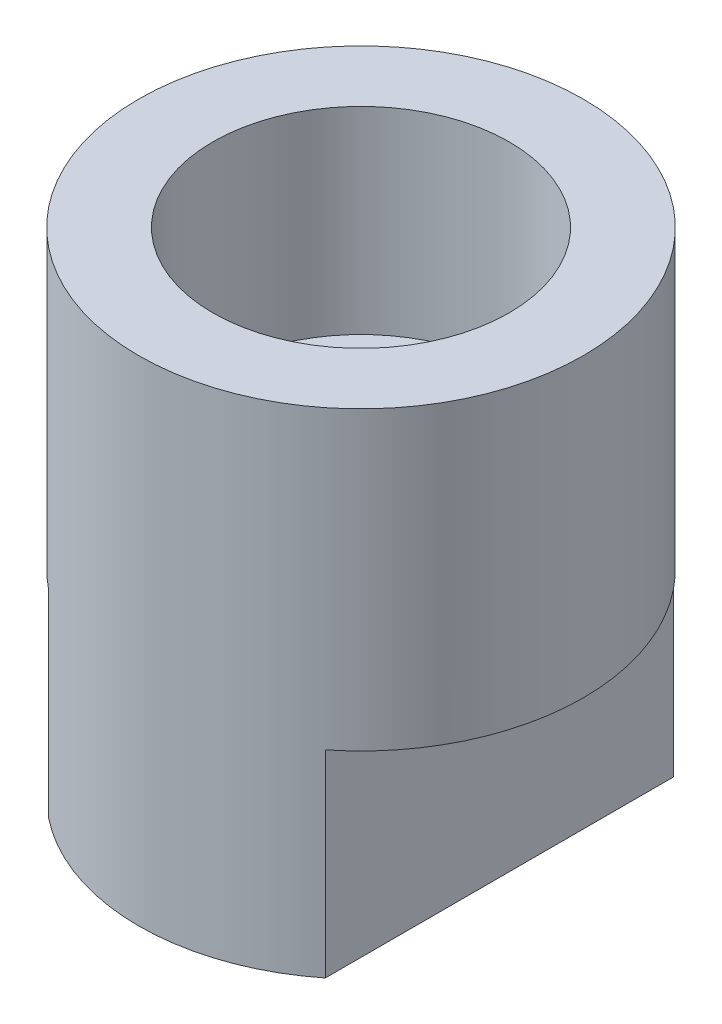
ISO-10303-21;
HEADER;
FILE_DESCRIPTION(('STEP AP214'),'2;1');
FILE_NAME('part.step','',(''),(''),'','','');
FILE_SCHEMA(('AUTOMOTIVE_DESIGN { 1 0 10303 214 1 1 1 1 }'));
ENDSEC;
DATA;
#1=APPLICATION_CONTEXT('core data for automotive mechanical design processes');
#2=APPLICATION_PROTOCOL_DEFINITION('international standard','automotive_design',2000,#1);
#3=PRODUCT_CONTEXT('',#1,'mechanical');
#4=PRODUCT('Part','Part','',(#3));
#5=PRODUCT_RELATED_PRODUCT_CATEGORY('part','',(#4));
#6=PRODUCT_DEFINITION_FORMATION('','',#4);
#7=PRODUCT_DEFINITION_CONTEXT('part definition',#1,'design');
#8=PRODUCT_DEFINITION('design','',#6,#7);
#9=PRODUCT_DEFINITION_SHAPE('','',#8);
#10=(LENGTH_UNIT() NAMED_UNIT(*) SI_UNIT(.MILLI.,.METRE.));
#11=(NAMED_UNIT(*) PLANE_ANGLE_UNIT() SI_UNIT($,.RADIAN.));
#12=(NAMED_UNIT(*) SI_UNIT($,.STERADIAN.) SOLID_ANGLE_UNIT());
#13=UNCERTAINTY_MEASURE_WITH_UNIT(LENGTH_MEASURE(1.E-05),#10,'distance_accuracy_value','');
#14=(GEOMETRIC_REPRESENTATION_CONTEXT(3) GLOBAL_UNCERTAINTY_ASSIGNED_CONTEXT((#13)) GLOBAL_UNIT_ASSIGNED_CONTEXT((#10,
#11,#12)) REPRESENTATION_CONTEXT('',''));
#15=CARTESIAN_POINT('',(0.,0.,0.));
#16=DIRECTION('',(0.,0.,1.));
#17=DIRECTION('',(1.,0.,0.));
#18=AXIS2_PLACEMENT_3D('',#15,#16,#17);
#19=CARTESIAN_POINT('',(-14.,50.,0.));
#20=DIRECTION('',(-1.,0.,0.));
#21=DIRECTION('',(0.,0.,1.));
#22=AXIS2_PLACEMENT_3D('',#19,#20,#21);
#23=PLANE('',#22);
#24=DIRECTION('',(0.,-1.,0.));
#25=VECTOR('',#24,1.);
#26=CARTESIAN_POINT('',(-14.,50.,17.6139149538085));
#27=LINE('',#26,#25);
#28=CARTESIAN_POINT('',(-14.,20.,17.6139149538085));
#29=VERTEX_POINT('',#28);
#30=CARTESIAN_POINT('',(-14.,0.,17.6139149538085));
#31=VERTEX_POINT('',#30);
#32=EDGE_CURVE('E81',#29,#31,#27,.T.);
#33=ORIENTED_EDGE('',*,*,#32,.F.);
#34=DIRECTION('',(0.,0.,-1.));
#35=VECTOR('',#34,1.);
#36=CARTESIAN_POINT('',(-14.,20.,0.));
#37=LINE('',#36,#35);
#38=CARTESIAN_POINT('',(-14.,20.,-17.6139149538085));
#39=VERTEX_POINT('',#38);
#40=EDGE_CURVE('E50',#29,#39,#37,.T.);
#41=ORIENTED_EDGE('',*,*,#40,.T.);
#42=DIRECTION('',(0.,-1.,0.));
#43=VECTOR('',#42,1.);
#44=CARTESIAN_POINT('',(-14.,50.,-17.6139149538085));
#45=LINE('',#44,#43);
#46=CARTESIAN_POINT('',(-14.,0.,-17.6139149538085));
#47=VERTEX_POINT('',#46);
#48=EDGE_CURVE('E43',#39,#47,#45,.T.);
#49=ORIENTED_EDGE('',*,*,#48,.T.);
#50=DIRECTION('',(0.,0.,-1.));
#51=VECTOR('',#50,1.);
#52=CARTESIAN_POINT('',(-14.,0.,0.));
#53=LINE('',#52,#51);
#54=EDGE_CURVE('E86',#31,#47,#53,.T.);
#55=ORIENTED_EDGE('',*,*,#54,.F.);
#56=EDGE_LOOP('',(#33,#41,#49,#55));
#57=FACE_BOUND('',#56,.T.);
#58=ADVANCED_FACE('F35',(#57),#23,.T.);
#59=CARTESIAN_POINT('',(14.,50.,0.));
#60=DIRECTION('',(-1.,0.,0.));
#61=DIRECTION('',(0.,0.,1.));
#62=AXIS2_PLACEMENT_3D('',#59,#60,#61);
#63=PLANE('',#62);
#64=DIRECTION('',(0.,-1.,0.));
#65=VECTOR('',#64,1.);
#66=CARTESIAN_POINT('',(14.,50.,-17.6139149538085));
#67=LINE('',#66,#65);
#68=CARTESIAN_POINT('',(14.,20.,-17.6139149538085));
#69=VERTEX_POINT('',#68);
#70=CARTESIAN_POINT('',(14.,0.,-17.6139149538085));
#71=VERTEX_POINT('',#70);
#72=EDGE_CURVE('E11',#69,#71,#67,.T.);
#73=ORIENTED_EDGE('',*,*,#72,.F.);
#74=DIRECTION('',(0.,0.,-1.));
#75=VECTOR('',#74,1.);
#76=CARTESIAN_POINT('',(14.,20.,0.));
#77=LINE('',#76,#75);
#78=CARTESIAN_POINT('',(14.,20.,17.6139149538085));
#79=VERTEX_POINT('',#78);
#80=EDGE_CURVE('E87',#79,#69,#77,.T.);
#81=ORIENTED_EDGE('',*,*,#80,.F.);
#82=DIRECTION('',(0.,-1.,0.));
#83=VECTOR('',#82,1.);
#84=CARTESIAN_POINT('',(14.,50.,17.6139149538085));
#85=LINE('',#84,#83);
#86=CARTESIAN_POINT('',(14.,0.,17.6139149538085));
#87=VERTEX_POINT('',#86);
#88=EDGE_CURVE('E88',#79,#87,#85,.T.);
#89=ORIENTED_EDGE('',*,*,#88,.T.);
#90=DIRECTION('',(0.,0.,-1.));
#91=VECTOR('',#90,1.);
#92=CARTESIAN_POINT('',(14.,0.,0.));
#93=LINE('',#92,#91);
#94=EDGE_CURVE('E98',#87,#71,#93,.T.);
#95=ORIENTED_EDGE('',*,*,#94,.T.);
#96=EDGE_LOOP('',(#73,#81,#89,#95));
#97=FACE_BOUND('',#96,.T.);
#98=ADVANCED_FACE('F37',(#97),#63,.F.);
#99=CARTESIAN_POINT('',(0.,50.,0.));
#100=DIRECTION('',(0.,-1.,0.));
#101=DIRECTION('',(0.,0.,-1.));
#102=AXIS2_PLACEMENT_3D('',#99,#100,#101);
#103=CYLINDRICAL_SURFACE('',#102,15.);
#104=CARTESIAN_POINT('',(0.,30.,0.));
#105=DIRECTION('',(0.,1.,0.));
#106=DIRECTION('',(0.,0.,1.));
#107=AXIS2_PLACEMENT_3D('',#104,#105,#106);
#108=CIRCLE('',#107,15.);
#109=CARTESIAN_POINT('',(0.,30.,15.));
#110=VERTEX_POINT('',#109);
#111=EDGE_CURVE('E74',#110,#110,#108,.T.);
#112=ORIENTED_EDGE('',*,*,#111,.F.);
#113=EDGE_LOOP('',(#112));
#114=FACE_BOUND('',#113,.T.);
#115=CARTESIAN_POINT('',(0.,50.,0.));
#116=DIRECTION('',(0.,1.,0.));
#117=DIRECTION('',(0.,0.,1.));
#118=AXIS2_PLACEMENT_3D('',#115,#116,#117);
#119=CIRCLE('',#118,15.);
#120=CARTESIAN_POINT('',(0.,50.,15.));
#121=VERTEX_POINT('',#120);
#122=EDGE_CURVE('E102',#121,#121,#119,.T.);
#123=ORIENTED_EDGE('',*,*,#122,.T.);
#124=EDGE_LOOP('',(#123));
#125=FACE_BOUND('',#124,.T.);
#126=ADVANCED_FACE('F133',(#114,#125),#103,.F.);
#127=CARTESIAN_POINT('',(0.,50.,0.));
#128=DIRECTION('',(0.,-1.,0.));
#129=DIRECTION('',(0.,0.,-1.));
#130=AXIS2_PLACEMENT_3D('',#127,#128,#129);
#131=CYLINDRICAL_SURFACE('',#130,22.5);
#132=ORIENTED_EDGE('',*,*,#48,.F.);
#133=CARTESIAN_POINT('',(0.,20.,0.));
#134=DIRECTION('',(0.,1.,0.));
#135=DIRECTION('',(0.,0.,1.));
#136=AXIS2_PLACEMENT_3D('',#133,#134,#135);
#137=CIRCLE('',#136,22.5);
#138=EDGE_CURVE('E73',#39,#29,#137,.T.);
#139=ORIENTED_EDGE('',*,*,#138,.T.);
#140=ORIENTED_EDGE('',*,*,#32,.T.);
#141=CARTESIAN_POINT('',(0.,0.,0.));
#142=DIRECTION('',(0.,1.,0.));
#143=DIRECTION('',(0.,0.,1.));
#144=AXIS2_PLACEMENT_3D('',#141,#142,#143);
#145=CIRCLE('',#144,22.5);
#146=EDGE_CURVE('E83',#31,#87,#145,.T.);
#147=ORIENTED_EDGE('',*,*,#146,.T.);
#148=ORIENTED_EDGE('',*,*,#88,.F.);
#149=CARTESIAN_POINT('',(0.,20.,0.));
#150=DIRECTION('',(0.,1.,0.));
#151=DIRECTION('',(0.,0.,1.));
#152=AXIS2_PLACEMENT_3D('',#149,#150,#151);
#153=CIRCLE('',#152,22.5);
#154=EDGE_CURVE('E90',#79,#69,#153,.T.);
#155=ORIENTED_EDGE('',*,*,#154,.T.);
#156=ORIENTED_EDGE('',*,*,#72,.T.);
#157=CARTESIAN_POINT('',(0.,0.,0.));
#158=DIRECTION('',(0.,1.,0.));
#159=DIRECTION('',(0.,0.,1.));
#160=AXIS2_PLACEMENT_3D('',#157,#158,#159);
#161=CIRCLE('',#160,22.5);
#162=EDGE_CURVE('E107',#71,#47,#161,.T.);
#163=ORIENTED_EDGE('',*,*,#162,.T.);
#164=EDGE_LOOP('',(#132,#139,#140,#147,#148,#155,#156,#163));
#165=FACE_BOUND('',#164,.T.);
#166=CARTESIAN_POINT('',(0.,50.,0.));
#167=DIRECTION('',(0.,1.,0.));
#168=DIRECTION('',(0.,0.,1.));
#169=AXIS2_PLACEMENT_3D('',#166,#167,#168);
#170=CIRCLE('',#169,22.5);
#171=CARTESIAN_POINT('',(0.,50.,22.5));
#172=VERTEX_POINT('',#171);
#173=EDGE_CURVE('E99',#172,#172,#170,.T.);
#174=ORIENTED_EDGE('',*,*,#173,.F.);
#175=EDGE_LOOP('',(#174));
#176=FACE_BOUND('',#175,.T.);
#177=ADVANCED_FACE('F78',(#165,#176),#131,.T.);
#178=CARTESIAN_POINT('',(0.,50.,0.));
#179=DIRECTION('',(0.,1.,0.));
#180=DIRECTION('',(0.,0.,1.));
#181=AXIS2_PLACEMENT_3D('',#178,#179,#180);
#182=PLANE('',#181);
#183=ORIENTED_EDGE('',*,*,#173,.T.);
#184=EDGE_LOOP('',(#183));
#185=FACE_BOUND('',#184,.T.);
#186=ORIENTED_EDGE('',*,*,#122,.F.);
#187=EDGE_LOOP('',(#186));
#188=FACE_BOUND('',#187,.T.);
#189=ADVANCED_FACE('F139',(#185,#188),#182,.T.);
#190=CARTESIAN_POINT('',(0.,0.,0.));
#191=DIRECTION('',(0.,1.,0.));
#192=DIRECTION('',(0.,0.,1.));
#193=AXIS2_PLACEMENT_3D('',#190,#191,#192);
#194=PLANE('',#193);
#195=ORIENTED_EDGE('',*,*,#94,.F.);
#196=ORIENTED_EDGE('',*,*,#146,.F.);
#197=ORIENTED_EDGE('',*,*,#54,.T.);
#198=ORIENTED_EDGE('',*,*,#162,.F.);
#199=EDGE_LOOP('',(#195,#196,#197,#198));
#200=FACE_BOUND('',#199,.T.);
#201=CARTESIAN_POINT('',(0.,0.,0.));
#202=DIRECTION('',(0.,1.,0.));
#203=DIRECTION('',(0.,0.,1.));
#204=AXIS2_PLACEMENT_3D('',#201,#202,#203);
#205=CIRCLE('',#204,10.);
#206=CARTESIAN_POINT('',(0.,0.,10.));
#207=VERTEX_POINT('',#206);
#208=EDGE_CURVE('E115',#207,#207,#205,.T.);
#209=ORIENTED_EDGE('',*,*,#208,.T.);
#210=EDGE_LOOP('',(#209));
#211=FACE_BOUND('',#210,.T.);
#212=ADVANCED_FACE('F111',(#200,#211),#194,.F.);
#213=CARTESIAN_POINT('',(0.,20.,0.));
#214=DIRECTION('',(0.,1.,0.));
#215=DIRECTION('',(0.,0.,1.));
#216=AXIS2_PLACEMENT_3D('',#213,#214,#215);
#217=PLANE('',#216);
#218=ORIENTED_EDGE('',*,*,#80,.T.);
#219=ORIENTED_EDGE('',*,*,#154,.F.);
#220=EDGE_LOOP('',(#218,#219));
#221=FACE_BOUND('',#220,.T.);
#222=ADVANCED_FACE('F147',(#221),#217,.F.);
#223=CARTESIAN_POINT('',(0.,20.,0.));
#224=DIRECTION('',(0.,1.,0.));
#225=DIRECTION('',(0.,0.,1.));
#226=AXIS2_PLACEMENT_3D('',#223,#224,#225);
#227=PLANE('',#226);
#228=ORIENTED_EDGE('',*,*,#40,.F.);
#229=ORIENTED_EDGE('',*,*,#138,.F.);
#230=EDGE_LOOP('',(#228,#229));
#231=FACE_BOUND('',#230,.T.);
#232=ADVANCED_FACE('F72',(#231),#227,.F.);
#233=CARTESIAN_POINT('',(0.,30.,0.));
#234=DIRECTION('',(0.,-1.,0.));
#235=DIRECTION('',(0.,0.,-1.));
#236=AXIS2_PLACEMENT_3D('',#233,#234,#235);
#237=CYLINDRICAL_SURFACE('',#236,10.);
#238=CARTESIAN_POINT('',(0.,30.,0.));
#239=DIRECTION('',(0.,1.,0.));
#240=DIRECTION('',(0.,0.,1.));
#241=AXIS2_PLACEMENT_3D('',#238,#239,#240);
#242=CIRCLE('',#241,10.);
#243=CARTESIAN_POINT('',(0.,30.,10.));
#244=VERTEX_POINT('',#243);
#245=EDGE_CURVE('E118',#244,#244,#242,.T.);
#246=ORIENTED_EDGE('',*,*,#245,.T.);
#247=EDGE_LOOP('',(#246));
#248=FACE_BOUND('',#247,.T.);
#249=ORIENTED_EDGE('',*,*,#208,.F.);
#250=EDGE_LOOP('',(#249));
#251=FACE_BOUND('',#250,.T.);
#252=ADVANCED_FACE('F124',(#248,#251),#237,.F.);
#253=CARTESIAN_POINT('',(0.,30.,0.));
#254=DIRECTION('',(0.,1.,0.));
#255=DIRECTION('',(0.,0.,1.));
#256=AXIS2_PLACEMENT_3D('',#253,#254,#255);
#257=PLANE('',#256);
#258=ORIENTED_EDGE('',*,*,#245,.F.);
#259=EDGE_LOOP('',(#258));
#260=FACE_BOUND('',#259,.T.);
#261=ORIENTED_EDGE('',*,*,#111,.T.);
#262=EDGE_LOOP('',(#261));
#263=FACE_BOUND('',#262,.T.);
#264=ADVANCED_FACE('F127',(#260,#263),#257,.T.);
#265=CLOSED_SHELL('',(#58,#98,#126,#177,#189,#212,#222,#232,#252,#264));
#266=MANIFOLD_SOLID_BREP('B2',#265);
#267=ADVANCED_BREP_SHAPE_REPRESENTATION('',(#18,#266),#14);
#268=SHAPE_DEFINITION_REPRESENTATION(#9,#267);
ENDSEC;
END-ISO-10303-21;
